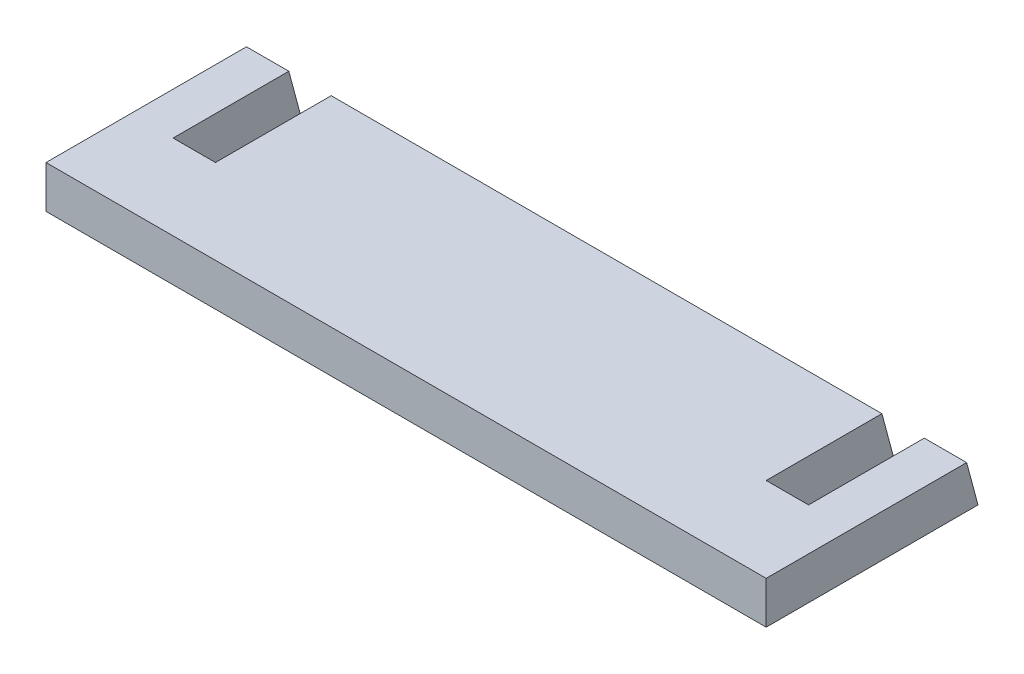
ISO-10303-21;
HEADER;
FILE_DESCRIPTION(('STEP AP214'),'2;1');
FILE_NAME('part.step','',(''),(''),'','','');
FILE_SCHEMA(('AUTOMOTIVE_DESIGN { 1 0 10303 214 1 1 1 1 }'));
ENDSEC;
DATA;
#1=APPLICATION_CONTEXT('core data for automotive mechanical design processes');
#2=APPLICATION_PROTOCOL_DEFINITION('international standard','automotive_design',2000,#1);
#3=PRODUCT_CONTEXT('',#1,'mechanical');
#4=PRODUCT('Part','Part','',(#3));
#5=PRODUCT_RELATED_PRODUCT_CATEGORY('part','',(#4));
#6=PRODUCT_DEFINITION_FORMATION('','',#4);
#7=PRODUCT_DEFINITION_CONTEXT('part definition',#1,'design');
#8=PRODUCT_DEFINITION('design','',#6,#7);
#9=PRODUCT_DEFINITION_SHAPE('','',#8);
#10=(LENGTH_UNIT() NAMED_UNIT(*) SI_UNIT(.MILLI.,.METRE.));
#11=(NAMED_UNIT(*) PLANE_ANGLE_UNIT() SI_UNIT($,.RADIAN.));
#12=(NAMED_UNIT(*) SI_UNIT($,.STERADIAN.) SOLID_ANGLE_UNIT());
#13=UNCERTAINTY_MEASURE_WITH_UNIT(LENGTH_MEASURE(1.E-05),#10,'distance_accuracy_value','');
#14=(GEOMETRIC_REPRESENTATION_CONTEXT(3) GLOBAL_UNCERTAINTY_ASSIGNED_CONTEXT((#13)) GLOBAL_UNIT_ASSIGNED_CONTEXT((#10,
#11,#12)) REPRESENTATION_CONTEXT('',''));
#15=CARTESIAN_POINT('',(0.,0.,0.));
#16=DIRECTION('',(0.,0.,1.));
#17=DIRECTION('',(1.,0.,0.));
#18=AXIS2_PLACEMENT_3D('',#15,#16,#17);
#19=CARTESIAN_POINT('',(0.,10.,0.));
#20=DIRECTION('',(0.,1.,0.));
#21=DIRECTION('',(0.,0.,1.));
#22=AXIS2_PLACEMENT_3D('',#19,#20,#21);
#23=PLANE('',#22);
#24=DIRECTION('',(1.,0.,0.));
#25=VECTOR('',#24,1.);
#26=CARTESIAN_POINT('',(-65.,10.,4.99999999999999));
#27=LINE('',#26,#25);
#28=CARTESIAN_POINT('',(-75.,10.,4.99999999999999));
#29=VERTEX_POINT('',#28);
#30=CARTESIAN_POINT('',(-65.,10.,4.99999999999999));
#31=VERTEX_POINT('',#30);
#32=EDGE_CURVE('E142',#29,#31,#27,.T.);
#33=ORIENTED_EDGE('',*,*,#32,.F.);
#34=DIRECTION('',(0.,0.,1.));
#35=VECTOR('',#34,1.);
#36=CARTESIAN_POINT('',(-75.,10.,4.99999999999999));
#37=LINE('',#36,#35);
#38=CARTESIAN_POINT('',(-75.,10.,-22.3205080756888));
#39=VERTEX_POINT('',#38);
#40=EDGE_CURVE('E133',#39,#29,#37,.T.);
#41=ORIENTED_EDGE('',*,*,#40,.F.);
#42=DIRECTION('',(-1.,0.,0.));
#43=VECTOR('',#42,1.);
#44=CARTESIAN_POINT('',(-85.,10.,-22.3205080756888));
#45=LINE('',#44,#43);
#46=CARTESIAN_POINT('',(-85.,10.,-22.3205080756888));
#47=VERTEX_POINT('',#46);
#48=EDGE_CURVE('E228',#39,#47,#45,.T.);
#49=ORIENTED_EDGE('',*,*,#48,.T.);
#50=DIRECTION('',(0.,0.,1.));
#51=VECTOR('',#50,1.);
#52=CARTESIAN_POINT('',(-85.,10.,-25.));
#53=LINE('',#52,#51);
#54=CARTESIAN_POINT('',(-85.,10.,25.));
#55=VERTEX_POINT('',#54);
#56=EDGE_CURVE('E199',#47,#55,#53,.T.);
#57=ORIENTED_EDGE('',*,*,#56,.T.);
#58=DIRECTION('',(1.,0.,0.));
#59=VECTOR('',#58,1.);
#60=CARTESIAN_POINT('',(-85.,10.,25.));
#61=LINE('',#60,#59);
#62=CARTESIAN_POINT('',(85.,10.,25.));
#63=VERTEX_POINT('',#62);
#64=EDGE_CURVE('E203',#55,#63,#61,.T.);
#65=ORIENTED_EDGE('',*,*,#64,.T.);
#66=DIRECTION('',(0.,0.,-1.));
#67=VECTOR('',#66,1.);
#68=CARTESIAN_POINT('',(85.,10.,-25.));
#69=LINE('',#68,#67);
#70=CARTESIAN_POINT('',(85.,10.,-22.3205080756888));
#71=VERTEX_POINT('',#70);
#72=EDGE_CURVE('E195',#63,#71,#69,.T.);
#73=ORIENTED_EDGE('',*,*,#72,.T.);
#74=CARTESIAN_POINT('',(75.,10.,-22.3205080756888));
#75=VERTEX_POINT('',#74);
#76=EDGE_CURVE('E229',#71,#75,#45,.T.);
#77=ORIENTED_EDGE('',*,*,#76,.T.);
#78=DIRECTION('',(0.,0.,-1.));
#79=VECTOR('',#78,1.);
#80=CARTESIAN_POINT('',(75.,10.,4.99999999999999));
#81=LINE('',#80,#79);
#82=CARTESIAN_POINT('',(75.,10.,4.99999999999999));
#83=VERTEX_POINT('',#82);
#84=EDGE_CURVE('E173',#83,#75,#81,.T.);
#85=ORIENTED_EDGE('',*,*,#84,.F.);
#86=DIRECTION('',(1.,0.,0.));
#87=VECTOR('',#86,1.);
#88=CARTESIAN_POINT('',(65.,10.,4.99999999999999));
#89=LINE('',#88,#87);
#90=CARTESIAN_POINT('',(65.,10.,4.99999999999999));
#91=VERTEX_POINT('',#90);
#92=EDGE_CURVE('E170',#91,#83,#89,.T.);
#93=ORIENTED_EDGE('',*,*,#92,.F.);
#94=DIRECTION('',(0.,0.,1.));
#95=VECTOR('',#94,1.);
#96=CARTESIAN_POINT('',(65.,10.,4.99999999999999));
#97=LINE('',#96,#95);
#98=CARTESIAN_POINT('',(65.,10.,-22.3205080756888));
#99=VERTEX_POINT('',#98);
#100=EDGE_CURVE('E176',#99,#91,#97,.T.);
#101=ORIENTED_EDGE('',*,*,#100,.F.);
#102=CARTESIAN_POINT('',(-65.,10.,-22.3205080756888));
#103=VERTEX_POINT('',#102);
#104=EDGE_CURVE('E234',#99,#103,#45,.T.);
#105=ORIENTED_EDGE('',*,*,#104,.T.);
#106=DIRECTION('',(0.,0.,-1.));
#107=VECTOR('',#106,1.);
#108=CARTESIAN_POINT('',(-65.,10.,4.99999999999999));
#109=LINE('',#108,#107);
#110=EDGE_CURVE('E58',#31,#103,#109,.T.);
#111=ORIENTED_EDGE('',*,*,#110,.F.);
#112=EDGE_LOOP('',(#33,#41,#49,#57,#65,#73,#77,#85,#93,#101,#105,#111));
#113=FACE_BOUND('',#112,.T.);
#114=ADVANCED_FACE('F41',(#113),#23,.T.);
#115=CARTESIAN_POINT('',(0.,0.,0.));
#116=DIRECTION('',(0.,1.,0.));
#117=DIRECTION('',(0.,0.,1.));
#118=AXIS2_PLACEMENT_3D('',#115,#116,#117);
#119=PLANE('',#118);
#120=DIRECTION('',(0.,0.,1.));
#121=VECTOR('',#120,1.);
#122=CARTESIAN_POINT('',(-75.,0.,4.99999999999999));
#123=LINE('',#122,#121);
#124=CARTESIAN_POINT('',(-75.,0.,-25.));
#125=VERTEX_POINT('',#124);
#126=CARTESIAN_POINT('',(-75.,0.,4.99999999999999));
#127=VERTEX_POINT('',#126);
#128=EDGE_CURVE('E159',#125,#127,#123,.T.);
#129=ORIENTED_EDGE('',*,*,#128,.T.);
#130=DIRECTION('',(1.,0.,0.));
#131=VECTOR('',#130,1.);
#132=CARTESIAN_POINT('',(-65.,0.,4.99999999999999));
#133=LINE('',#132,#131);
#134=CARTESIAN_POINT('',(-65.,0.,4.99999999999999));
#135=VERTEX_POINT('',#134);
#136=EDGE_CURVE('E148',#127,#135,#133,.T.);
#137=ORIENTED_EDGE('',*,*,#136,.T.);
#138=DIRECTION('',(0.,0.,-1.));
#139=VECTOR('',#138,1.);
#140=CARTESIAN_POINT('',(-65.,0.,4.99999999999999));
#141=LINE('',#140,#139);
#142=CARTESIAN_POINT('',(-65.,0.,-25.));
#143=VERTEX_POINT('',#142);
#144=EDGE_CURVE('E143',#135,#143,#141,.T.);
#145=ORIENTED_EDGE('',*,*,#144,.T.);
#146=DIRECTION('',(-1.,0.,0.));
#147=VECTOR('',#146,1.);
#148=CARTESIAN_POINT('',(-85.,0.,-25.));
#149=LINE('',#148,#147);
#150=CARTESIAN_POINT('',(65.,0.,-25.));
#151=VERTEX_POINT('',#150);
#152=EDGE_CURVE('E216',#151,#143,#149,.T.);
#153=ORIENTED_EDGE('',*,*,#152,.F.);
#154=DIRECTION('',(0.,0.,1.));
#155=VECTOR('',#154,1.);
#156=CARTESIAN_POINT('',(65.,0.,4.99999999999999));
#157=LINE('',#156,#155);
#158=CARTESIAN_POINT('',(65.,0.,4.99999999999999));
#159=VERTEX_POINT('',#158);
#160=EDGE_CURVE('E66',#151,#159,#157,.T.);
#161=ORIENTED_EDGE('',*,*,#160,.T.);
#162=DIRECTION('',(1.,0.,0.));
#163=VECTOR('',#162,1.);
#164=CARTESIAN_POINT('',(65.,0.,4.99999999999999));
#165=LINE('',#164,#163);
#166=CARTESIAN_POINT('',(75.,0.,4.99999999999999));
#167=VERTEX_POINT('',#166);
#168=EDGE_CURVE('E180',#159,#167,#165,.T.);
#169=ORIENTED_EDGE('',*,*,#168,.T.);
#170=DIRECTION('',(0.,0.,-1.));
#171=VECTOR('',#170,1.);
#172=CARTESIAN_POINT('',(75.,0.,4.99999999999999));
#173=LINE('',#172,#171);
#174=CARTESIAN_POINT('',(75.,0.,-25.));
#175=VERTEX_POINT('',#174);
#176=EDGE_CURVE('E184',#167,#175,#173,.T.);
#177=ORIENTED_EDGE('',*,*,#176,.T.);
#178=CARTESIAN_POINT('',(85.,0.,-25.));
#179=VERTEX_POINT('',#178);
#180=EDGE_CURVE('E211',#179,#175,#149,.T.);
#181=ORIENTED_EDGE('',*,*,#180,.F.);
#182=DIRECTION('',(0.,0.,-1.));
#183=VECTOR('',#182,1.);
#184=CARTESIAN_POINT('',(85.,0.,-25.));
#185=LINE('',#184,#183);
#186=CARTESIAN_POINT('',(85.,0.,25.));
#187=VERTEX_POINT('',#186);
#188=EDGE_CURVE('E150',#187,#179,#185,.T.);
#189=ORIENTED_EDGE('',*,*,#188,.F.);
#190=DIRECTION('',(1.,0.,0.));
#191=VECTOR('',#190,1.);
#192=CARTESIAN_POINT('',(-85.,0.,25.));
#193=LINE('',#192,#191);
#194=CARTESIAN_POINT('',(-85.,0.,25.));
#195=VERTEX_POINT('',#194);
#196=EDGE_CURVE('E200',#195,#187,#193,.T.);
#197=ORIENTED_EDGE('',*,*,#196,.F.);
#198=DIRECTION('',(0.,0.,1.));
#199=VECTOR('',#198,1.);
#200=CARTESIAN_POINT('',(-85.,0.,-25.));
#201=LINE('',#200,#199);
#202=CARTESIAN_POINT('',(-85.,0.,-25.));
#203=VERTEX_POINT('',#202);
#204=EDGE_CURVE('E215',#203,#195,#201,.T.);
#205=ORIENTED_EDGE('',*,*,#204,.F.);
#206=EDGE_CURVE('E210',#125,#203,#149,.T.);
#207=ORIENTED_EDGE('',*,*,#206,.F.);
#208=EDGE_LOOP('',(#129,#137,#145,#153,#161,#169,#177,#181,#189,#197,#205,#207));
#209=FACE_BOUND('',#208,.T.);
#210=ADVANCED_FACE('F282',(#209),#119,.F.);
#211=CARTESIAN_POINT('',(0.,10.,-22.3205080756888));
#212=DIRECTION('',(0.,0.258819045102518,-0.965925826289069));
#213=DIRECTION('',(1.,0.,0.));
#214=AXIS2_PLACEMENT_3D('',#211,#212,#213);
#215=PLANE('',#214);
#216=ORIENTED_EDGE('',*,*,#48,.F.);
#217=DIRECTION('',(0.,-0.965925826289069,-0.258819045102518));
#218=VECTOR('',#217,1.);
#219=CARTESIAN_POINT('',(-75.,10.,-22.3205080756888));
#220=LINE('',#219,#218);
#221=EDGE_CURVE('E11',#39,#125,#220,.T.);
#222=ORIENTED_EDGE('',*,*,#221,.T.);
#223=ORIENTED_EDGE('',*,*,#206,.T.);
#224=DIRECTION('',(0.,-0.965925826289069,-0.258819045102518));
#225=VECTOR('',#224,1.);
#226=CARTESIAN_POINT('',(-85.,10.,-22.3205080756888));
#227=LINE('',#226,#225);
#228=EDGE_CURVE('E233',#47,#203,#227,.T.);
#229=ORIENTED_EDGE('',*,*,#228,.F.);
#230=EDGE_LOOP('',(#216,#222,#223,#229));
#231=FACE_BOUND('',#230,.T.);
#232=ADVANCED_FACE('F44',(#231),#215,.T.);
#233=ORIENTED_EDGE('',*,*,#152,.T.);
#234=DIRECTION('',(0.,0.965925826289069,0.258819045102518));
#235=VECTOR('',#234,1.);
#236=CARTESIAN_POINT('',(-65.,10.,-22.3205080756888));
#237=LINE('',#236,#235);
#238=EDGE_CURVE('E51',#143,#103,#237,.T.);
#239=ORIENTED_EDGE('',*,*,#238,.T.);
#240=ORIENTED_EDGE('',*,*,#104,.F.);
#241=DIRECTION('',(0.,-0.965925826289069,-0.258819045102518));
#242=VECTOR('',#241,1.);
#243=CARTESIAN_POINT('',(65.,10.,-22.3205080756888));
#244=LINE('',#243,#242);
#245=EDGE_CURVE('E241',#99,#151,#244,.T.);
#246=ORIENTED_EDGE('',*,*,#245,.T.);
#247=EDGE_LOOP('',(#233,#239,#240,#246));
#248=FACE_BOUND('',#247,.T.);
#249=ADVANCED_FACE('F251',(#248),#215,.T.);
#250=ORIENTED_EDGE('',*,*,#180,.T.);
#251=DIRECTION('',(0.,0.965925826289069,0.258819045102518));
#252=VECTOR('',#251,1.);
#253=CARTESIAN_POINT('',(75.,10.,-22.3205080756888));
#254=LINE('',#253,#252);
#255=EDGE_CURVE('E244',#175,#75,#254,.T.);
#256=ORIENTED_EDGE('',*,*,#255,.T.);
#257=ORIENTED_EDGE('',*,*,#76,.F.);
#258=DIRECTION('',(0.,0.965925826289069,0.258819045102518));
#259=VECTOR('',#258,1.);
#260=CARTESIAN_POINT('',(85.,10.,-22.3205080756888));
#261=LINE('',#260,#259);
#262=EDGE_CURVE('E238',#179,#71,#261,.T.);
#263=ORIENTED_EDGE('',*,*,#262,.F.);
#264=EDGE_LOOP('',(#250,#256,#257,#263));
#265=FACE_BOUND('',#264,.T.);
#266=ADVANCED_FACE('F277',(#265),#215,.T.);
#267=CARTESIAN_POINT('',(85.,10.,-25.));
#268=DIRECTION('',(-1.,0.,0.));
#269=DIRECTION('',(0.,0.,1.));
#270=AXIS2_PLACEMENT_3D('',#267,#268,#269);
#271=PLANE('',#270);
#272=ORIENTED_EDGE('',*,*,#188,.T.);
#273=ORIENTED_EDGE('',*,*,#262,.T.);
#274=ORIENTED_EDGE('',*,*,#72,.F.);
#275=DIRECTION('',(0.,-1.,0.));
#276=VECTOR('',#275,1.);
#277=CARTESIAN_POINT('',(85.,10.,25.));
#278=LINE('',#277,#276);
#279=EDGE_CURVE('E206',#63,#187,#278,.T.);
#280=ORIENTED_EDGE('',*,*,#279,.T.);
#281=EDGE_LOOP('',(#272,#273,#274,#280));
#282=FACE_BOUND('',#281,.T.);
#283=ADVANCED_FACE('F310',(#282),#271,.F.);
#284=CARTESIAN_POINT('',(-85.,10.,-25.));
#285=DIRECTION('',(1.,0.,0.));
#286=DIRECTION('',(0.,0.,-1.));
#287=AXIS2_PLACEMENT_3D('',#284,#285,#286);
#288=PLANE('',#287);
#289=ORIENTED_EDGE('',*,*,#56,.F.);
#290=ORIENTED_EDGE('',*,*,#228,.T.);
#291=ORIENTED_EDGE('',*,*,#204,.T.);
#292=DIRECTION('',(0.,-1.,0.));
#293=VECTOR('',#292,1.);
#294=CARTESIAN_POINT('',(-85.,10.,25.));
#295=LINE('',#294,#293);
#296=EDGE_CURVE('E224',#55,#195,#295,.T.);
#297=ORIENTED_EDGE('',*,*,#296,.F.);
#298=EDGE_LOOP('',(#289,#290,#291,#297));
#299=FACE_BOUND('',#298,.T.);
#300=ADVANCED_FACE('F265',(#299),#288,.F.);
#301=CARTESIAN_POINT('',(-85.,10.,25.));
#302=DIRECTION('',(0.,0.,-1.));
#303=DIRECTION('',(-1.,0.,0.));
#304=AXIS2_PLACEMENT_3D('',#301,#302,#303);
#305=PLANE('',#304);
#306=ORIENTED_EDGE('',*,*,#196,.T.);
#307=ORIENTED_EDGE('',*,*,#279,.F.);
#308=ORIENTED_EDGE('',*,*,#64,.F.);
#309=ORIENTED_EDGE('',*,*,#296,.T.);
#310=EDGE_LOOP('',(#306,#307,#308,#309));
#311=FACE_BOUND('',#310,.T.);
#312=ADVANCED_FACE('F270',(#311),#305,.F.);
#313=CARTESIAN_POINT('',(65.,10.,4.99999999999999));
#314=DIRECTION('',(0.,0.,-1.));
#315=DIRECTION('',(-1.,0.,0.));
#316=AXIS2_PLACEMENT_3D('',#313,#314,#315);
#317=PLANE('',#316);
#318=ORIENTED_EDGE('',*,*,#168,.F.);
#319=DIRECTION('',(0.,-1.,0.));
#320=VECTOR('',#319,1.);
#321=CARTESIAN_POINT('',(65.,10.,4.99999999999999));
#322=LINE('',#321,#320);
#323=EDGE_CURVE('E179',#91,#159,#322,.T.);
#324=ORIENTED_EDGE('',*,*,#323,.F.);
#325=ORIENTED_EDGE('',*,*,#92,.T.);
#326=DIRECTION('',(0.,-1.,0.));
#327=VECTOR('',#326,1.);
#328=CARTESIAN_POINT('',(75.,10.,4.99999999999999));
#329=LINE('',#328,#327);
#330=EDGE_CURVE('E162',#83,#167,#329,.T.);
#331=ORIENTED_EDGE('',*,*,#330,.T.);
#332=EDGE_LOOP('',(#318,#324,#325,#331));
#333=FACE_BOUND('',#332,.T.);
#334=ADVANCED_FACE('F287',(#333),#317,.T.);
#335=CARTESIAN_POINT('',(75.,10.,4.99999999999999));
#336=DIRECTION('',(-1.,0.,0.));
#337=DIRECTION('',(0.,0.,1.));
#338=AXIS2_PLACEMENT_3D('',#335,#336,#337);
#339=PLANE('',#338);
#340=ORIENTED_EDGE('',*,*,#176,.F.);
#341=ORIENTED_EDGE('',*,*,#330,.F.);
#342=ORIENTED_EDGE('',*,*,#84,.T.);
#343=ORIENTED_EDGE('',*,*,#255,.F.);
#344=EDGE_LOOP('',(#340,#341,#342,#343));
#345=FACE_BOUND('',#344,.T.);
#346=ADVANCED_FACE('F279',(#345),#339,.T.);
#347=CARTESIAN_POINT('',(65.,10.,4.99999999999999));
#348=DIRECTION('',(1.,0.,0.));
#349=DIRECTION('',(0.,0.,-1.));
#350=AXIS2_PLACEMENT_3D('',#347,#348,#349);
#351=PLANE('',#350);
#352=ORIENTED_EDGE('',*,*,#100,.T.);
#353=ORIENTED_EDGE('',*,*,#323,.T.);
#354=ORIENTED_EDGE('',*,*,#160,.F.);
#355=ORIENTED_EDGE('',*,*,#245,.F.);
#356=EDGE_LOOP('',(#352,#353,#354,#355));
#357=FACE_BOUND('',#356,.T.);
#358=ADVANCED_FACE('F288',(#357),#351,.T.);
#359=CARTESIAN_POINT('',(-75.,10.,4.99999999999999));
#360=DIRECTION('',(1.,0.,0.));
#361=DIRECTION('',(0.,0.,-1.));
#362=AXIS2_PLACEMENT_3D('',#359,#360,#361);
#363=PLANE('',#362);
#364=ORIENTED_EDGE('',*,*,#40,.T.);
#365=DIRECTION('',(0.,-1.,0.));
#366=VECTOR('',#365,1.);
#367=CARTESIAN_POINT('',(-75.,10.,4.99999999999999));
#368=LINE('',#367,#366);
#369=EDGE_CURVE('E136',#29,#127,#368,.T.);
#370=ORIENTED_EDGE('',*,*,#369,.T.);
#371=ORIENTED_EDGE('',*,*,#128,.F.);
#372=ORIENTED_EDGE('',*,*,#221,.F.);
#373=EDGE_LOOP('',(#364,#370,#371,#372));
#374=FACE_BOUND('',#373,.T.);
#375=ADVANCED_FACE('F135',(#374),#363,.T.);
#376=CARTESIAN_POINT('',(-65.,10.,4.99999999999999));
#377=DIRECTION('',(0.,0.,-1.));
#378=DIRECTION('',(-1.,0.,0.));
#379=AXIS2_PLACEMENT_3D('',#376,#377,#378);
#380=PLANE('',#379);
#381=ORIENTED_EDGE('',*,*,#136,.F.);
#382=ORIENTED_EDGE('',*,*,#369,.F.);
#383=ORIENTED_EDGE('',*,*,#32,.T.);
#384=DIRECTION('',(0.,-1.,0.));
#385=VECTOR('',#384,1.);
#386=CARTESIAN_POINT('',(-65.,10.,4.99999999999999));
#387=LINE('',#386,#385);
#388=EDGE_CURVE('E151',#31,#135,#387,.T.);
#389=ORIENTED_EDGE('',*,*,#388,.T.);
#390=EDGE_LOOP('',(#381,#382,#383,#389));
#391=FACE_BOUND('',#390,.T.);
#392=ADVANCED_FACE('F146',(#391),#380,.T.);
#393=CARTESIAN_POINT('',(-65.,10.,4.99999999999999));
#394=DIRECTION('',(-1.,0.,0.));
#395=DIRECTION('',(0.,0.,1.));
#396=AXIS2_PLACEMENT_3D('',#393,#394,#395);
#397=PLANE('',#396);
#398=ORIENTED_EDGE('',*,*,#144,.F.);
#399=ORIENTED_EDGE('',*,*,#388,.F.);
#400=ORIENTED_EDGE('',*,*,#110,.T.);
#401=ORIENTED_EDGE('',*,*,#238,.F.);
#402=EDGE_LOOP('',(#398,#399,#400,#401));
#403=FACE_BOUND('',#402,.T.);
#404=ADVANCED_FACE('F291',(#403),#397,.T.);
#405=CLOSED_SHELL('',(#114,#210,#232,#249,#266,#283,#300,#312,#334,#346,#358,#375,#392,#404));
#406=MANIFOLD_SOLID_BREP('B2',#405);
#407=ADVANCED_BREP_SHAPE_REPRESENTATION('',(#18,#406),#14);
#408=SHAPE_DEFINITION_REPRESENTATION(#9,#407);
ENDSEC;
END-ISO-10303-21;
